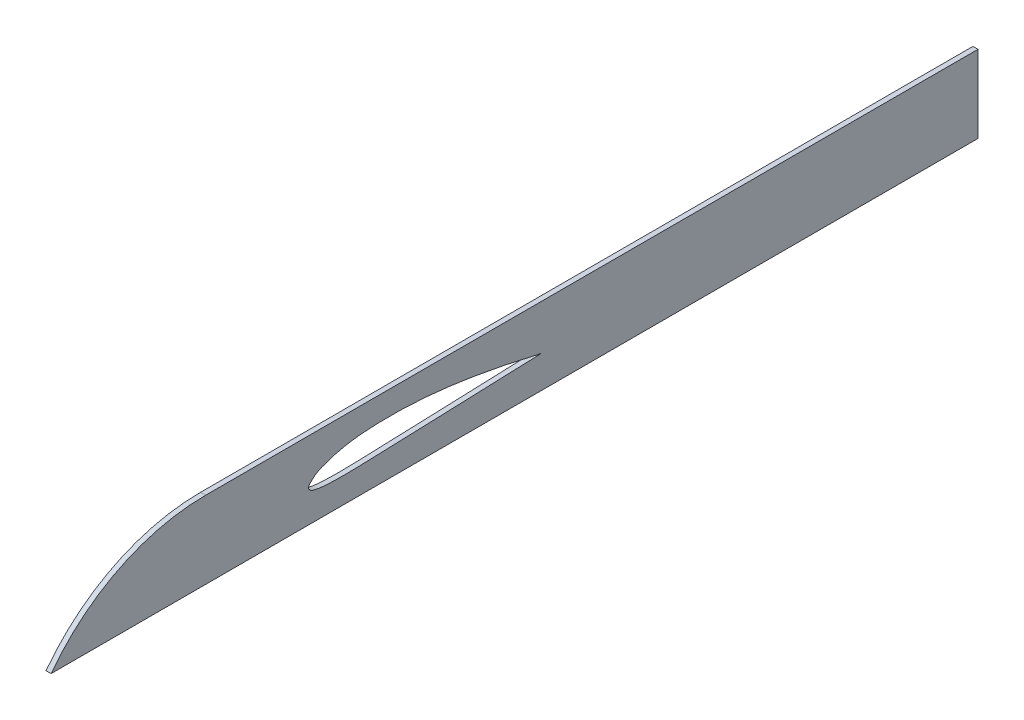
ISO-10303-21;
HEADER;
FILE_DESCRIPTION(('STEP AP214'),'2;1');
FILE_NAME('part.step','',(''),(''),'','','');
FILE_SCHEMA(('AUTOMOTIVE_DESIGN { 1 0 10303 214 1 1 1 1 }'));
ENDSEC;
DATA;
#1=APPLICATION_CONTEXT('core data for automotive mechanical design processes');
#2=APPLICATION_PROTOCOL_DEFINITION('international standard','automotive_design',2000,#1);
#3=PRODUCT_CONTEXT('',#1,'mechanical');
#4=PRODUCT('Part','Part','',(#3));
#5=PRODUCT_RELATED_PRODUCT_CATEGORY('part','',(#4));
#6=PRODUCT_DEFINITION_FORMATION('','',#4);
#7=PRODUCT_DEFINITION_CONTEXT('part definition',#1,'design');
#8=PRODUCT_DEFINITION('design','',#6,#7);
#9=PRODUCT_DEFINITION_SHAPE('','',#8);
#10=(LENGTH_UNIT() NAMED_UNIT(*) SI_UNIT(.MILLI.,.METRE.));
#11=(NAMED_UNIT(*) PLANE_ANGLE_UNIT() SI_UNIT($,.RADIAN.));
#12=(NAMED_UNIT(*) SI_UNIT($,.STERADIAN.) SOLID_ANGLE_UNIT());
#13=UNCERTAINTY_MEASURE_WITH_UNIT(LENGTH_MEASURE(1.E-05),#10,'distance_accuracy_value','');
#14=(GEOMETRIC_REPRESENTATION_CONTEXT(3) GLOBAL_UNCERTAINTY_ASSIGNED_CONTEXT((#13)) GLOBAL_UNIT_ASSIGNED_CONTEXT((#10,
#11,#12)) REPRESENTATION_CONTEXT('',''));
#15=CARTESIAN_POINT('',(0.,0.,0.));
#16=DIRECTION('',(0.,0.,1.));
#17=DIRECTION('',(1.,0.,0.));
#18=AXIS2_PLACEMENT_3D('',#15,#16,#17);
#19=CARTESIAN_POINT('',(5.,-114.3,-152.4));
#20=DIRECTION('',(-1.,0.,0.));
#21=DIRECTION('',(0.,0.,1.));
#22=AXIS2_PLACEMENT_3D('',#19,#20,#21);
#23=PLANE('',#22);
#24=CARTESIAN_POINT('',(5.,-114.3,-152.4));
#25=DIRECTION('',(1.,0.,0.));
#26=DIRECTION('',(0.,0.,1.));
#27=AXIS2_PLACEMENT_3D('',#24,#25,#26);
#28=CIRCLE('',#27,190.5);
#29=CARTESIAN_POINT('',(5.,76.1999999999999,-152.4));
#30=VERTEX_POINT('',#29);
#31=CARTESIAN_POINT('',(5.,0.,0.));
#32=VERTEX_POINT('',#31);
#33=EDGE_CURVE('E92',#30,#32,#28,.T.);
#34=ORIENTED_EDGE('',*,*,#33,.T.);
#35=DIRECTION('',(0.,0.,-1.));
#36=VECTOR('',#35,1.);
#37=CARTESIAN_POINT('',(5.,0.,0.));
#38=LINE('',#37,#36);
#39=CARTESIAN_POINT('',(5.,0.,-914.4));
#40=VERTEX_POINT('',#39);
#41=EDGE_CURVE('E87',#32,#40,#38,.T.);
#42=ORIENTED_EDGE('',*,*,#41,.T.);
#43=DIRECTION('',(0.,1.,0.));
#44=VECTOR('',#43,1.);
#45=CARTESIAN_POINT('',(5.,0.,-914.4));
#46=LINE('',#45,#44);
#47=CARTESIAN_POINT('',(5.,76.2,-914.4));
#48=VERTEX_POINT('',#47);
#49=EDGE_CURVE('E90',#40,#48,#46,.T.);
#50=ORIENTED_EDGE('',*,*,#49,.T.);
#51=DIRECTION('',(0.,0.,1.));
#52=VECTOR('',#51,1.);
#53=CARTESIAN_POINT('',(5.,76.2,-914.4));
#54=LINE('',#53,#52);
#55=EDGE_CURVE('E57',#48,#30,#54,.T.);
#56=ORIENTED_EDGE('',*,*,#55,.T.);
#57=EDGE_LOOP('',(#34,#42,#50,#56));
#58=FACE_BOUND('',#57,.T.);
#59=CARTESIAN_POINT('',(5.00000000000012,31.75,-482.600154209033));
#60=CARTESIAN_POINT('',(5.00000000000012,31.7969787483364,-482.60017015833));
#61=CARTESIAN_POINT('',(5.00000000000012,32.6447771322485,-482.64028381514));
#62=CARTESIAN_POINT('',(5.00000000000012,32.1873815343392,-479.982523669499));
#63=CARTESIAN_POINT('',(5.00000000000012,33.0271221292034,-478.115665344998));
#64=CARTESIAN_POINT('',(5.00000000000012,33.507921736001,-475.724301027393));
#65=CARTESIAN_POINT('',(5.00000000000012,34.2279005975688,-472.709352117299));
#66=CARTESIAN_POINT('',(5.00000000000012,35.1062067229994,-468.886614739731));
#67=CARTESIAN_POINT('',(5.00000000000012,36.1409522609736,-464.320717677363));
#68=CARTESIAN_POINT('',(5.00000000000012,37.1517373451688,-459.74847528013));
#69=CARTESIAN_POINT('',(5.00000000000012,38.140890664725,-455.178081305346));
#70=CARTESIAN_POINT('',(5.00000000000012,39.1033731232585,-450.606469545235));
#71=CARTESIAN_POINT('',(5.00000000000012,40.0566875517848,-446.039163177557));
#72=CARTESIAN_POINT('',(5.00000000000012,40.9351048604634,-441.46149814344));
#73=CARTESIAN_POINT('',(5.00000000000012,41.8525246212771,-436.897391982804));
#74=CARTESIAN_POINT('',(5.00000000000012,42.6829152446313,-432.319547923377));
#75=CARTESIAN_POINT('',(5.00000000000012,43.5534410076343,-427.754836962584));
#76=CARTESIAN_POINT('',(5.00000000000012,44.3451409728048,-423.179856990654));
#77=CARTESIAN_POINT('',(5.00000000000012,45.1414420190599,-418.612251439048));
#78=CARTESIAN_POINT('',(5.00000000000012,45.8592194934314,-414.035460927516));
#79=CARTESIAN_POINT('',(5.00000000000012,46.6150849999063,-409.469689950955));
#80=CARTESIAN_POINT('',(5.00000000000012,47.2928991694788,-404.895169699155));
#81=CARTESIAN_POINT('',(5.00000000000012,47.9733377379731,-400.326675803926));
#82=CARTESIAN_POINT('',(5.00000000000012,48.5827076098119,-395.752450022637));
#83=CARTESIAN_POINT('',(5.00000000000012,49.2007507441486,-391.185223071628));
#84=CARTESIAN_POINT('',(5.00000000000012,49.7161926956907,-386.609871363026));
#85=CARTESIAN_POINT('',(5.00000000000012,50.2244842177173,-382.038539278224));
#86=CARTESIAN_POINT('',(5.00000000000012,50.7253628394532,-377.46996388595));
#87=CARTESIAN_POINT('',(5.00000000000012,51.1250738010119,-372.895167583223));
#88=CARTESIAN_POINT('',(5.00000000000012,51.5270583980522,-368.324942709255));
#89=CARTESIAN_POINT('',(5.00000000000012,51.8828185008825,-363.753987996623));
#90=CARTESIAN_POINT('',(5.00000000000012,52.1470898889905,-359.180165639956));
#91=CARTESIAN_POINT('',(5.00000000000012,52.4125674057969,-354.609293691681));
#92=CARTESIAN_POINT('',(5.00000000000012,52.626976055273,-350.037633690696));
#93=CARTESIAN_POINT('',(5.00000000000012,52.7702275608238,-345.465251818578));
#94=CARTESIAN_POINT('',(5.00000000000012,52.8378122375479,-340.892754847925));
#95=CARTESIAN_POINT('',(5.00000000000012,52.8676606501421,-336.32059482558));
#96=CARTESIAN_POINT('',(5.00000000000012,52.8497254345569,-331.748328873294));
#97=CARTESIAN_POINT('',(5.00000000000012,52.7863116868297,-327.176040481476));
#98=CARTESIAN_POINT('',(5.00000000000012,52.6782488158101,-322.603629892253));
#99=CARTESIAN_POINT('',(5.00000000000012,52.5199118169366,-318.031413584805));
#100=CARTESIAN_POINT('',(5.00000000000012,52.3329455593649,-313.457313582338));
#101=CARTESIAN_POINT('',(5.00000000000012,52.036027869359,-308.884320844862));
#102=CARTESIAN_POINT('',(5.00000000000012,51.6586580619715,-304.309653751624));
#103=CARTESIAN_POINT('',(5.00000000000012,51.1635342152004,-299.734221484033));
#104=CARTESIAN_POINT('',(5.00000000000012,50.5326240551203,-295.157509369727));
#105=CARTESIAN_POINT('',(5.00000000000012,49.7377160841188,-290.581694172913));
#106=CARTESIAN_POINT('',(5.00000000000012,48.7741578578516,-286.009753881829));
#107=CARTESIAN_POINT('',(5.00000000000012,47.6903142901219,-281.428610585236));
#108=CARTESIAN_POINT('',(5.00000000000012,46.4234882890357,-276.84363987059));
#109=CARTESIAN_POINT('',(5.00000000000012,44.9030460473015,-272.27115206505));
#110=CARTESIAN_POINT('',(5.00000000000012,43.4968951702434,-268.44820892433));
#111=CARTESIAN_POINT('',(5.00000000000012,42.1414876906505,-265.410323966739));
#112=CARTESIAN_POINT('',(5.00000000000012,40.9504146666303,-263.112322773888));
#113=CARTESIAN_POINT('',(5.00000000000012,39.5570564541858,-260.786234986392));
#114=CARTESIAN_POINT('',(5.00000000000012,37.9333694874154,-258.638672859029));
#115=CARTESIAN_POINT('',(5.00000000000012,36.3930859832752,-257.015681400847));
#116=CARTESIAN_POINT('',(5.00000000000012,35.1282953222782,-255.801288583334));
#117=CARTESIAN_POINT('',(5.00000000000012,34.2200957709877,-255.014866713428));
#118=CARTESIAN_POINT('',(5.00000000000012,33.4393702604278,-254.49595513909));
#119=CARTESIAN_POINT('',(5.00000000000012,32.9230414274239,-254.247412686713));
#120=CARTESIAN_POINT('',(5.00000000000012,32.4805117787885,-254.08781539145));
#121=CARTESIAN_POINT('',(5.00000000000012,31.8426904638014,-253.939935661788));
#122=CARTESIAN_POINT('',(5.00000000000012,31.1780398930827,-254.003201841094));
#123=CARTESIAN_POINT('',(5.00000000000012,30.6063322142347,-254.25076304047));
#124=CARTESIAN_POINT('',(5.00000000000012,30.1435525417865,-254.487970184137));
#125=CARTESIAN_POINT('',(5.00000000000012,29.4720751544225,-255.000339131027));
#126=CARTESIAN_POINT('',(5.00000000000012,28.7529629731828,-255.764760467896));
#127=CARTESIAN_POINT('',(5.00000000000012,27.9352338004585,-256.966422477176));
#128=CARTESIAN_POINT('',(5.00000000000012,27.2727398771929,-258.67022047982));
#129=CARTESIAN_POINT('',(5.00000000000012,26.8435107637764,-260.846622407683));
#130=CARTESIAN_POINT('',(5.00000000000012,26.3864105472304,-263.129311348872));
#131=CARTESIAN_POINT('',(5.00000000000012,26.0441943134345,-265.417667326317));
#132=CARTESIAN_POINT('',(5.00000000000012,25.7102084696218,-268.464802745675));
#133=CARTESIAN_POINT('',(5.00000000000012,25.4640826122768,-272.278007626116));
#134=CARTESIAN_POINT('',(5.00000000000012,25.2605451448778,-276.8511967658));
#135=CARTESIAN_POINT('',(5.00000000000012,25.1030412163978,-281.423334984662));
#136=CARTESIAN_POINT('',(5.00000000000012,25.0815276125647,-285.996225617508));
#137=CARTESIAN_POINT('',(5.00000000000012,25.0187915301186,-290.568509129304));
#138=CARTESIAN_POINT('',(5.00000000000012,25.122224793075,-295.140173231717));
#139=CARTESIAN_POINT('',(5.00000000000012,25.1508428480969,-299.713349873405));
#140=CARTESIAN_POINT('',(5.00000000000012,25.3126195090135,-304.284370598076));
#141=CARTESIAN_POINT('',(5.00000000000012,25.4279379323416,-308.857211381917));
#142=CARTESIAN_POINT('',(5.00000000000012,25.5960104305777,-313.42873540667));
#143=CARTESIAN_POINT('',(5.00000000000012,25.7366197356728,-318.00169631115));
#144=CARTESIAN_POINT('',(5.00000000000012,25.9344072440514,-322.572604868665));
#145=CARTESIAN_POINT('',(5.00000000000012,26.0679480590371,-327.146126882564));
#146=CARTESIAN_POINT('',(5.00000000000012,26.2643539886555,-331.717080676365));
#147=CARTESIAN_POINT('',(5.00000000000012,26.4104888328222,-336.289860661108));
#148=CARTESIAN_POINT('',(5.00000000000012,26.5578596921853,-340.862595863795));
#149=CARTESIAN_POINT('',(5.00000000000012,26.7505571133193,-345.433684020535));
#150=CARTESIAN_POINT('',(5.00000000000012,26.8976855298794,-350.006428007166));
#151=CARTESIAN_POINT('',(5.00000000000012,27.0447901679554,-354.579172855315));
#152=CARTESIAN_POINT('',(5.00000000000012,27.2375589334469,-359.150258427178));
#153=CARTESIAN_POINT('',(5.00000000000012,27.3846682339351,-363.723003106403));
#154=CARTESIAN_POINT('',(5.00000000000012,27.5317780004097,-368.295747768744));
#155=CARTESIAN_POINT('',(5.00000000000012,27.7245453677674,-372.866833391266));
#156=CARTESIAN_POINT('',(5.00000000000012,27.8716551316067,-377.439578053693));
#157=CARTESIAN_POINT('',(5.00000000000012,28.0187644426365,-382.012322732573));
#158=CARTESIAN_POINT('',(5.00000000000012,28.2115331685923,-386.583408305731));
#159=CARTESIAN_POINT('',(5.00000000000012,28.3586379542472,-391.156153149048));
#160=CARTESIAN_POINT('',(5.00000000000012,28.5057658200096,-395.72889715371));
#161=CARTESIAN_POINT('',(5.00000000000012,28.6984652969993,-400.29998524315));
#162=CARTESIAN_POINT('',(5.00000000000012,28.8458284848919,-404.872720696965));
#163=CARTESIAN_POINT('',(5.00000000000012,28.9919919599959,-409.445499744469));
#164=CARTESIAN_POINT('',(5.00000000000012,29.188291024651,-414.016457036515));
#165=CARTESIAN_POINT('',(5.00000000000012,29.3222306334204,-418.589965995822));
#166=CARTESIAN_POINT('',(5.00000000000012,29.5185297071698,-423.160923277534));
#167=CARTESIAN_POINT('',(5.00000000000012,29.664693145902,-427.733702366372));
#168=CARTESIAN_POINT('',(5.00000000000012,29.8120564701916,-432.30643766518));
#169=CARTESIAN_POINT('',(5.00000000000012,30.0047554379044,-436.877526333382));
#170=CARTESIAN_POINT('',(5.00000000000012,30.1518852040915,-441.450268178332));
#171=CARTESIAN_POINT('',(5.00000000000012,30.2989828970988,-446.023021081991));
#172=CARTESIAN_POINT('',(5.00000000000012,30.4917780963628,-450.594076569921));
#173=CARTESIAN_POINT('',(5.00000000000012,30.6387886216759,-455.166933512469));
#174=CARTESIAN_POINT('',(5.00000000000012,30.7862670668006,-459.739259192128));
#175=CARTESIAN_POINT('',(5.00000000000012,30.9776583313905,-464.311908667682));
#176=CARTESIAN_POINT('',(5.00000000000012,31.1299030547573,-468.878817779009));
#177=CARTESIAN_POINT('',(5.00000000000012,31.2365211980275,-472.707491960929));
#178=CARTESIAN_POINT('',(5.00000000000012,31.3899978392381,-475.718239151376));
#179=CARTESIAN_POINT('',(5.00000000000012,31.3812104062824,-478.117040956672));
#180=CARTESIAN_POINT('',(5.00000000000012,31.8338193019088,-479.978948943739));
#181=CARTESIAN_POINT('',(5.00000000000012,30.8681550211961,-482.63867083727));
#182=CARTESIAN_POINT('',(5.00000000000012,31.7030212516637,-482.600138259737));
#183=CARTESIAN_POINT('',(5.00000000000012,31.75,-482.600154209033));
#184=B_SPLINE_CURVE_WITH_KNOTS('',3,(#59,#60,#61,#62,#63,#64,#65,#66,#67,#68,#69,#70,#71,#72,
#73,#74,#75,#76,#77,#78,#79,#80,#81,#82,#83,#84,#85,#86,#87,#88,#89,#90,#91,#92,#93,#94,#95,#96,
#97,#98,#99,#100,#101,#102,#103,#104,#105,#106,#107,#108,#109,#110,#111,#112,#113,#114,#115,
#116,#117,#118,#119,#120,#121,#122,#123,#124,#125,#126,#127,#128,#129,#130,#131,#132,#133,#134,
#135,#136,#137,#138,#139,#140,#141,#142,#143,#144,#145,#146,#147,#148,#149,#150,#151,#152,#153,
#154,#155,#156,#157,#158,#159,#160,#161,#162,#163,#164,#165,#166,#167,#168,#169,#170,#171,#172,
#173,#174,#175,#176,#177,#178,#179,#180,#181,#182,#183),.UNSPECIFIED.,.T.,.F.,(4,1,1,1,1,1,1,1,
1,1,1,1,1,1,1,1,1,1,1,1,1,1,1,1,1,1,1,1,1,1,1,1,1,1,1,1,1,1,1,1,1,1,1,1,1,1,1,1,1,1,1,1,1,1,1,1,
1,1,1,1,1,1,1,1,1,1,1,1,1,1,1,1,1,1,1,1,1,1,1,1,1,1,1,1,1,1,1,1,1,1,1,1,1,1,1,1,1,1,1,1,1,1,1,1,
1,1,1,1,1,1,1,1,1,1,1,1,1,1,1,1,1,1,4),(0.,0.000293365808662534,0.00532164017466566,
0.0103387292133674,0.0153670035793705,0.0203840926180723,0.0304182706954758,0.0404416024914457,
0.0504543150210545,0.0604566360224268,0.0704487939442089,0.0804310179328098,0.0903940642201864,
0.100357110507563,0.11030190372371,0.120246696939858,0.130174166814965,0.140093325200832,
0.149996563909746,0.159899802618659,0.169788063132481,0.179669188952908,0.189536756757346,
0.199397902217249,0.209241212830678,0.21907905733343,0.228911675824638,0.238730060621851,
0.248544183465038,0.25835050823059,0.268146954654559,0.277940594301047,0.287729350678479,
0.297512610464696,0.307292570813355,0.317071553337096,0.326850535860836,0.336630496209495,
0.346412411914752,0.356197259922253,0.365986016299685,0.375785512656923,0.38559963550011,
0.395437480002862,0.405311708087854,0.415239177962961,0.425231335884743,0.435287884616749,
0.4454428437726,0.455740406191331,0.466201501670347,0.471563180407638,0.477074156008609,
0.482801471774682,0.488942720606223,0.494304399343514,0.497140268827251,0.500195282443289,
0.5019990779814,0.503136330423955,0.50386319647057,0.505014031647029,0.507325031033084,
0.507960656951852,0.509010462124731,0.510653339756735,0.513350958495626,0.515710583501881,
0.519941847872338,0.52495893691104,0.529935838835567,0.534879969092478,0.539798891343855,
0.549601680563194,0.559390436940626,0.569173696726843,0.578953045946385,0.588732028470126,
0.598511988818785,0.608291949167444,0.61807520895366,0.627858468739877,0.637643316747377,
0.647428164754878,0.657214845005126,0.666999693012626,0.676786373262873,0.686571221270374,
0.696356069277874,0.706142749528122,0.715927597535622,0.725712445543123,0.73549912579337,
0.745283973800871,0.755068821808371,0.764855502058619,0.774640350066119,0.784425198073619,
0.794211878323867,0.803996726331367,0.813781574338868,0.823568254589115,0.833353102596616,
0.843137950604116,0.852924630854364,0.862709478861864,0.872496159112112,0.882281007119612,
0.892065855127112,0.90185253537736,0.91163738338486,0.921422231392361,0.931208911642609,
0.940993759650109,0.950778607657609,0.960565287907857,0.970350135915357,0.980134983922858,
0.985028324047981,0.989921664173105,0.994813294066214,0.999706634191338,1.),.UNSPECIFIED.);
#185=CARTESIAN_POINT('',(5.00000000000012,31.75,-482.600154209033));
#186=VERTEX_POINT('',#185);
#187=EDGE_CURVE('E112',#186,#186,#184,.F.);
#188=ORIENTED_EDGE('',*,*,#187,.T.);
#189=EDGE_LOOP('',(#188));
#190=FACE_BOUND('',#189,.T.);
#191=ADVANCED_FACE('F39',(#58,#190),#23,.F.);
#192=CARTESIAN_POINT('',(0.,-114.3,-152.4));
#193=DIRECTION('',(-1.,0.,0.));
#194=DIRECTION('',(0.,0.,1.));
#195=AXIS2_PLACEMENT_3D('',#192,#193,#194);
#196=PLANE('',#195);
#197=CARTESIAN_POINT('',(0.,-114.3,-152.4));
#198=DIRECTION('',(1.,0.,0.));
#199=DIRECTION('',(0.,0.,1.));
#200=AXIS2_PLACEMENT_3D('',#197,#198,#199);
#201=CIRCLE('',#200,190.5);
#202=CARTESIAN_POINT('',(0.,76.1999999999999,-152.4));
#203=VERTEX_POINT('',#202);
#204=CARTESIAN_POINT('',(0.,0.,0.));
#205=VERTEX_POINT('',#204);
#206=EDGE_CURVE('E108',#203,#205,#201,.T.);
#207=ORIENTED_EDGE('',*,*,#206,.F.);
#208=DIRECTION('',(0.,0.,1.));
#209=VECTOR('',#208,1.);
#210=CARTESIAN_POINT('',(0.,76.2,-914.4));
#211=LINE('',#210,#209);
#212=CARTESIAN_POINT('',(0.,76.2,-914.4));
#213=VERTEX_POINT('',#212);
#214=EDGE_CURVE('E80',#213,#203,#211,.T.);
#215=ORIENTED_EDGE('',*,*,#214,.F.);
#216=DIRECTION('',(0.,1.,0.));
#217=VECTOR('',#216,1.);
#218=CARTESIAN_POINT('',(0.,0.,-914.4));
#219=LINE('',#218,#217);
#220=CARTESIAN_POINT('',(0.,0.,-914.4));
#221=VERTEX_POINT('',#220);
#222=EDGE_CURVE('E74',#221,#213,#219,.T.);
#223=ORIENTED_EDGE('',*,*,#222,.F.);
#224=DIRECTION('',(0.,0.,-1.));
#225=VECTOR('',#224,1.);
#226=CARTESIAN_POINT('',(0.,0.,0.));
#227=LINE('',#226,#225);
#228=EDGE_CURVE('E97',#205,#221,#227,.T.);
#229=ORIENTED_EDGE('',*,*,#228,.F.);
#230=EDGE_LOOP('',(#207,#215,#223,#229));
#231=FACE_BOUND('',#230,.T.);
#232=CARTESIAN_POINT('',(0.,31.75,-482.600154209033));
#233=CARTESIAN_POINT('',(0.,31.7969787483364,-482.60017015833));
#234=CARTESIAN_POINT('',(0.,32.6447771322485,-482.64028381514));
#235=CARTESIAN_POINT('',(0.,32.1873815343392,-479.982523669499));
#236=CARTESIAN_POINT('',(0.,33.0271221292034,-478.115665344998));
#237=CARTESIAN_POINT('',(0.,33.507921736001,-475.724301027393));
#238=CARTESIAN_POINT('',(0.,34.2279005975688,-472.709352117299));
#239=CARTESIAN_POINT('',(0.,35.1062067229994,-468.886614739731));
#240=CARTESIAN_POINT('',(0.,36.1409522609736,-464.320717677363));
#241=CARTESIAN_POINT('',(0.,37.1517373451688,-459.74847528013));
#242=CARTESIAN_POINT('',(0.,38.140890664725,-455.178081305346));
#243=CARTESIAN_POINT('',(0.,39.1033731232585,-450.606469545235));
#244=CARTESIAN_POINT('',(0.,40.0566875517848,-446.039163177557));
#245=CARTESIAN_POINT('',(0.,40.9351048604634,-441.46149814344));
#246=CARTESIAN_POINT('',(0.,41.8525246212771,-436.897391982804));
#247=CARTESIAN_POINT('',(0.,42.6829152446313,-432.319547923377));
#248=CARTESIAN_POINT('',(0.,43.5534410076343,-427.754836962584));
#249=CARTESIAN_POINT('',(0.,44.3451409728048,-423.179856990654));
#250=CARTESIAN_POINT('',(0.,45.1414420190599,-418.612251439048));
#251=CARTESIAN_POINT('',(0.,45.8592194934314,-414.035460927516));
#252=CARTESIAN_POINT('',(0.,46.6150849999063,-409.469689950955));
#253=CARTESIAN_POINT('',(0.,47.2928991694788,-404.895169699155));
#254=CARTESIAN_POINT('',(0.,47.9733377379731,-400.326675803926));
#255=CARTESIAN_POINT('',(0.,48.5827076098119,-395.752450022637));
#256=CARTESIAN_POINT('',(0.,49.2007507441486,-391.185223071628));
#257=CARTESIAN_POINT('',(0.,49.7161926956907,-386.609871363026));
#258=CARTESIAN_POINT('',(0.,50.2244842177173,-382.038539278224));
#259=CARTESIAN_POINT('',(0.,50.7253628394532,-377.46996388595));
#260=CARTESIAN_POINT('',(0.,51.1250738010119,-372.895167583223));
#261=CARTESIAN_POINT('',(0.,51.5270583980522,-368.324942709255));
#262=CARTESIAN_POINT('',(0.,51.8828185008825,-363.753987996623));
#263=CARTESIAN_POINT('',(0.,52.1470898889905,-359.180165639956));
#264=CARTESIAN_POINT('',(0.,52.4125674057969,-354.609293691681));
#265=CARTESIAN_POINT('',(0.,52.626976055273,-350.037633690696));
#266=CARTESIAN_POINT('',(0.,52.7702275608238,-345.465251818578));
#267=CARTESIAN_POINT('',(0.,52.8378122375479,-340.892754847925));
#268=CARTESIAN_POINT('',(0.,52.8676606501421,-336.32059482558));
#269=CARTESIAN_POINT('',(0.,52.8497254345569,-331.748328873294));
#270=CARTESIAN_POINT('',(0.,52.7863116868297,-327.176040481476));
#271=CARTESIAN_POINT('',(0.,52.6782488158101,-322.603629892253));
#272=CARTESIAN_POINT('',(0.,52.5199118169366,-318.031413584805));
#273=CARTESIAN_POINT('',(0.,52.3329455593649,-313.457313582338));
#274=CARTESIAN_POINT('',(0.,52.036027869359,-308.884320844862));
#275=CARTESIAN_POINT('',(0.,51.6586580619715,-304.309653751624));
#276=CARTESIAN_POINT('',(0.,51.1635342152004,-299.734221484033));
#277=CARTESIAN_POINT('',(0.,50.5326240551203,-295.157509369727));
#278=CARTESIAN_POINT('',(0.,49.7377160841188,-290.581694172913));
#279=CARTESIAN_POINT('',(0.,48.7741578578516,-286.009753881829));
#280=CARTESIAN_POINT('',(0.,47.6903142901219,-281.428610585236));
#281=CARTESIAN_POINT('',(0.,46.4234882890357,-276.84363987059));
#282=CARTESIAN_POINT('',(0.,44.9030460473015,-272.27115206505));
#283=CARTESIAN_POINT('',(0.,43.4968951702434,-268.44820892433));
#284=CARTESIAN_POINT('',(0.,42.1414876906505,-265.410323966739));
#285=CARTESIAN_POINT('',(0.,40.9504146666303,-263.112322773888));
#286=CARTESIAN_POINT('',(0.,39.5570564541858,-260.786234986392));
#287=CARTESIAN_POINT('',(0.,37.9333694874154,-258.638672859029));
#288=CARTESIAN_POINT('',(0.,36.3930859832752,-257.015681400847));
#289=CARTESIAN_POINT('',(0.,35.1282953222782,-255.801288583334));
#290=CARTESIAN_POINT('',(0.,34.2200957709877,-255.014866713428));
#291=CARTESIAN_POINT('',(0.,33.4393702604278,-254.49595513909));
#292=CARTESIAN_POINT('',(0.,32.9230414274239,-254.247412686713));
#293=CARTESIAN_POINT('',(0.,32.4805117787885,-254.08781539145));
#294=CARTESIAN_POINT('',(0.,31.8426904638014,-253.939935661788));
#295=CARTESIAN_POINT('',(0.,31.1780398930827,-254.003201841094));
#296=CARTESIAN_POINT('',(0.,30.6063322142347,-254.25076304047));
#297=CARTESIAN_POINT('',(0.,30.1435525417865,-254.487970184137));
#298=CARTESIAN_POINT('',(0.,29.4720751544225,-255.000339131027));
#299=CARTESIAN_POINT('',(0.,28.7529629731828,-255.764760467896));
#300=CARTESIAN_POINT('',(0.,27.9352338004585,-256.966422477176));
#301=CARTESIAN_POINT('',(0.,27.2727398771929,-258.67022047982));
#302=CARTESIAN_POINT('',(0.,26.8435107637764,-260.846622407683));
#303=CARTESIAN_POINT('',(0.,26.3864105472304,-263.129311348872));
#304=CARTESIAN_POINT('',(0.,26.0441943134345,-265.417667326317));
#305=CARTESIAN_POINT('',(0.,25.7102084696218,-268.464802745675));
#306=CARTESIAN_POINT('',(0.,25.4640826122768,-272.278007626116));
#307=CARTESIAN_POINT('',(0.,25.2605451448778,-276.8511967658));
#308=CARTESIAN_POINT('',(0.,25.1030412163978,-281.423334984662));
#309=CARTESIAN_POINT('',(0.,25.0815276125647,-285.996225617508));
#310=CARTESIAN_POINT('',(0.,25.0187915301186,-290.568509129304));
#311=CARTESIAN_POINT('',(0.,25.122224793075,-295.140173231717));
#312=CARTESIAN_POINT('',(0.,25.1508428480969,-299.713349873405));
#313=CARTESIAN_POINT('',(0.,25.3126195090135,-304.284370598076));
#314=CARTESIAN_POINT('',(0.,25.4279379323416,-308.857211381917));
#315=CARTESIAN_POINT('',(0.,25.5960104305777,-313.42873540667));
#316=CARTESIAN_POINT('',(0.,25.7366197356728,-318.00169631115));
#317=CARTESIAN_POINT('',(0.,25.9344072440514,-322.572604868665));
#318=CARTESIAN_POINT('',(0.,26.0679480590371,-327.146126882564));
#319=CARTESIAN_POINT('',(0.,26.2643539886555,-331.717080676365));
#320=CARTESIAN_POINT('',(0.,26.4104888328222,-336.289860661108));
#321=CARTESIAN_POINT('',(0.,26.5578596921853,-340.862595863795));
#322=CARTESIAN_POINT('',(0.,26.7505571133193,-345.433684020535));
#323=CARTESIAN_POINT('',(0.,26.8976855298794,-350.006428007166));
#324=CARTESIAN_POINT('',(0.,27.0447901679554,-354.579172855315));
#325=CARTESIAN_POINT('',(0.,27.2375589334469,-359.150258427178));
#326=CARTESIAN_POINT('',(0.,27.3846682339351,-363.723003106403));
#327=CARTESIAN_POINT('',(0.,27.5317780004097,-368.295747768744));
#328=CARTESIAN_POINT('',(0.,27.7245453677674,-372.866833391266));
#329=CARTESIAN_POINT('',(0.,27.8716551316067,-377.439578053693));
#330=CARTESIAN_POINT('',(0.,28.0187644426365,-382.012322732573));
#331=CARTESIAN_POINT('',(0.,28.2115331685923,-386.583408305731));
#332=CARTESIAN_POINT('',(0.,28.3586379542472,-391.156153149048));
#333=CARTESIAN_POINT('',(0.,28.5057658200096,-395.72889715371));
#334=CARTESIAN_POINT('',(0.,28.6984652969993,-400.29998524315));
#335=CARTESIAN_POINT('',(0.,28.8458284848919,-404.872720696965));
#336=CARTESIAN_POINT('',(0.,28.9919919599959,-409.445499744469));
#337=CARTESIAN_POINT('',(0.,29.188291024651,-414.016457036515));
#338=CARTESIAN_POINT('',(0.,29.3222306334204,-418.589965995822));
#339=CARTESIAN_POINT('',(0.,29.5185297071698,-423.160923277534));
#340=CARTESIAN_POINT('',(0.,29.664693145902,-427.733702366372));
#341=CARTESIAN_POINT('',(0.,29.8120564701916,-432.30643766518));
#342=CARTESIAN_POINT('',(0.,30.0047554379044,-436.877526333382));
#343=CARTESIAN_POINT('',(0.,30.1518852040915,-441.450268178332));
#344=CARTESIAN_POINT('',(0.,30.2989828970988,-446.023021081991));
#345=CARTESIAN_POINT('',(0.,30.4917780963628,-450.594076569921));
#346=CARTESIAN_POINT('',(0.,30.6387886216759,-455.166933512469));
#347=CARTESIAN_POINT('',(0.,30.7862670668006,-459.739259192128));
#348=CARTESIAN_POINT('',(0.,30.9776583313905,-464.311908667682));
#349=CARTESIAN_POINT('',(0.,31.1299030547573,-468.878817779009));
#350=CARTESIAN_POINT('',(0.,31.2365211980275,-472.707491960929));
#351=CARTESIAN_POINT('',(0.,31.3899978392381,-475.718239151376));
#352=CARTESIAN_POINT('',(0.,31.3812104062824,-478.117040956672));
#353=CARTESIAN_POINT('',(0.,31.8338193019088,-479.978948943739));
#354=CARTESIAN_POINT('',(0.,30.8681550211961,-482.63867083727));
#355=CARTESIAN_POINT('',(0.,31.7030212516637,-482.600138259737));
#356=CARTESIAN_POINT('',(0.,31.75,-482.600154209033));
#357=B_SPLINE_CURVE_WITH_KNOTS('',3,(#232,#233,#234,#235,#236,#237,#238,#239,#240,#241,#242,
#243,#244,#245,#246,#247,#248,#249,#250,#251,#252,#253,#254,#255,#256,#257,#258,#259,#260,#261,
#262,#263,#264,#265,#266,#267,#268,#269,#270,#271,#272,#273,#274,#275,#276,#277,#278,#279,#280,
#281,#282,#283,#284,#285,#286,#287,#288,#289,#290,#291,#292,#293,#294,#295,#296,#297,#298,#299,
#300,#301,#302,#303,#304,#305,#306,#307,#308,#309,#310,#311,#312,#313,#314,#315,#316,#317,#318,
#319,#320,#321,#322,#323,#324,#325,#326,#327,#328,#329,#330,#331,#332,#333,#334,#335,#336,#337,
#338,#339,#340,#341,#342,#343,#344,#345,#346,#347,#348,#349,#350,#351,#352,#353,#354,#355,#356),
.UNSPECIFIED.,.T.,.F.,(4,1,1,1,1,1,1,1,1,1,1,1,1,1,1,1,1,1,1,1,1,1,1,1,1,1,1,1,1,1,1,1,1,1,1,1,
1,1,1,1,1,1,1,1,1,1,1,1,1,1,1,1,1,1,1,1,1,1,1,1,1,1,1,1,1,1,1,1,1,1,1,1,1,1,1,1,1,1,1,1,1,1,1,1,
1,1,1,1,1,1,1,1,1,1,1,1,1,1,1,1,1,1,1,1,1,1,1,1,1,1,1,1,1,1,1,1,1,1,1,1,1,1,4),(0.,
0.000293365808662534,0.00532164017466566,0.0103387292133674,0.0153670035793705,
0.0203840926180723,0.0304182706954758,0.0404416024914457,0.0504543150210545,0.0604566360224268,
0.0704487939442089,0.0804310179328098,0.0903940642201864,0.100357110507563,0.11030190372371,
0.120246696939858,0.130174166814965,0.140093325200832,0.149996563909746,0.159899802618659,
0.169788063132481,0.179669188952908,0.189536756757346,0.199397902217249,0.209241212830678,
0.21907905733343,0.228911675824638,0.238730060621851,0.248544183465038,0.25835050823059,
0.268146954654559,0.277940594301047,0.287729350678479,0.297512610464696,0.307292570813355,
0.317071553337096,0.326850535860836,0.336630496209495,0.346412411914752,0.356197259922253,
0.365986016299685,0.375785512656923,0.38559963550011,0.395437480002862,0.405311708087854,
0.415239177962961,0.425231335884743,0.435287884616749,0.4454428437726,0.455740406191331,
0.466201501670347,0.471563180407638,0.477074156008609,0.482801471774682,0.488942720606223,
0.494304399343514,0.497140268827251,0.500195282443289,0.5019990779814,0.503136330423955,
0.50386319647057,0.505014031647029,0.507325031033084,0.507960656951852,0.509010462124731,
0.510653339756735,0.513350958495626,0.515710583501881,0.519941847872338,0.52495893691104,
0.529935838835567,0.534879969092478,0.539798891343855,0.549601680563194,0.559390436940626,
0.569173696726843,0.578953045946385,0.588732028470126,0.598511988818785,0.608291949167444,
0.61807520895366,0.627858468739877,0.637643316747377,0.647428164754878,0.657214845005126,
0.666999693012626,0.676786373262873,0.686571221270374,0.696356069277874,0.706142749528122,
0.715927597535622,0.725712445543123,0.73549912579337,0.745283973800871,0.755068821808371,
0.764855502058619,0.774640350066119,0.784425198073619,0.794211878323867,0.803996726331367,
0.813781574338868,0.823568254589115,0.833353102596616,0.843137950604116,0.852924630854364,
0.862709478861864,0.872496159112112,0.882281007119612,0.892065855127112,0.90185253537736,
0.91163738338486,0.921422231392361,0.931208911642609,0.940993759650109,0.950778607657609,
0.960565287907857,0.970350135915357,0.980134983922858,0.985028324047981,0.989921664173105,
0.994813294066214,0.999706634191338,1.),.UNSPECIFIED.);
#358=CARTESIAN_POINT('',(0.,31.75,-482.600154209033));
#359=VERTEX_POINT('',#358);
#360=EDGE_CURVE('E135',#359,#359,#357,.T.);
#361=ORIENTED_EDGE('',*,*,#360,.T.);
#362=EDGE_LOOP('',(#361));
#363=FACE_BOUND('',#362,.T.);
#364=ADVANCED_FACE('F125',(#231,#363),#196,.T.);
#365=CARTESIAN_POINT('',(5.,-114.3,-152.4));
#366=DIRECTION('',(-1.,0.,0.));
#367=DIRECTION('',(0.,0.,1.));
#368=AXIS2_PLACEMENT_3D('',#365,#366,#367);
#369=CYLINDRICAL_SURFACE('',#368,190.5);
#370=ORIENTED_EDGE('',*,*,#206,.T.);
#371=DIRECTION('',(-1.,0.,0.));
#372=VECTOR('',#371,1.);
#373=CARTESIAN_POINT('',(5.,0.,0.));
#374=LINE('',#373,#372);
#375=EDGE_CURVE('E11',#32,#205,#374,.T.);
#376=ORIENTED_EDGE('',*,*,#375,.F.);
#377=ORIENTED_EDGE('',*,*,#33,.F.);
#378=DIRECTION('',(-1.,0.,0.));
#379=VECTOR('',#378,1.);
#380=CARTESIAN_POINT('',(5.,76.1999999999999,-152.4));
#381=LINE('',#380,#379);
#382=EDGE_CURVE('E104',#30,#203,#381,.T.);
#383=ORIENTED_EDGE('',*,*,#382,.T.);
#384=EDGE_LOOP('',(#370,#376,#377,#383));
#385=FACE_BOUND('',#384,.T.);
#386=ADVANCED_FACE('F41',(#385),#369,.T.);
#387=CARTESIAN_POINT('',(5.,0.,0.));
#388=DIRECTION('',(0.,1.,0.));
#389=DIRECTION('',(0.,0.,1.));
#390=AXIS2_PLACEMENT_3D('',#387,#388,#389);
#391=PLANE('',#390);
#392=ORIENTED_EDGE('',*,*,#228,.T.);
#393=DIRECTION('',(-1.,0.,0.));
#394=VECTOR('',#393,1.);
#395=CARTESIAN_POINT('',(5.,0.,-914.4));
#396=LINE('',#395,#394);
#397=EDGE_CURVE('E49',#40,#221,#396,.T.);
#398=ORIENTED_EDGE('',*,*,#397,.F.);
#399=ORIENTED_EDGE('',*,*,#41,.F.);
#400=ORIENTED_EDGE('',*,*,#375,.T.);
#401=EDGE_LOOP('',(#392,#398,#399,#400));
#402=FACE_BOUND('',#401,.T.);
#403=ADVANCED_FACE('F96',(#402),#391,.F.);
#404=CARTESIAN_POINT('',(5.,0.,-914.4));
#405=DIRECTION('',(0.,0.,1.));
#406=DIRECTION('',(1.,0.,0.));
#407=AXIS2_PLACEMENT_3D('',#404,#405,#406);
#408=PLANE('',#407);
#409=ORIENTED_EDGE('',*,*,#222,.T.);
#410=DIRECTION('',(-1.,0.,0.));
#411=VECTOR('',#410,1.);
#412=CARTESIAN_POINT('',(5.,76.2,-914.4));
#413=LINE('',#412,#411);
#414=EDGE_CURVE('E99',#48,#213,#413,.T.);
#415=ORIENTED_EDGE('',*,*,#414,.F.);
#416=ORIENTED_EDGE('',*,*,#49,.F.);
#417=ORIENTED_EDGE('',*,*,#397,.T.);
#418=EDGE_LOOP('',(#409,#415,#416,#417));
#419=FACE_BOUND('',#418,.T.);
#420=ADVANCED_FACE('F100',(#419),#408,.F.);
#421=CARTESIAN_POINT('',(5.,76.2,-914.4));
#422=DIRECTION('',(0.,-1.,0.));
#423=DIRECTION('',(0.,0.,-1.));
#424=AXIS2_PLACEMENT_3D('',#421,#422,#423);
#425=PLANE('',#424);
#426=ORIENTED_EDGE('',*,*,#214,.T.);
#427=ORIENTED_EDGE('',*,*,#382,.F.);
#428=ORIENTED_EDGE('',*,*,#55,.F.);
#429=ORIENTED_EDGE('',*,*,#414,.T.);
#430=EDGE_LOOP('',(#426,#427,#428,#429));
#431=FACE_BOUND('',#430,.T.);
#432=ADVANCED_FACE('F122',(#431),#425,.F.);
#433=CARTESIAN_POINT('',(235.38968891148,31.75,-482.600154209033));
#434=CARTESIAN_POINT('',(235.38968891148,31.7969787483364,-482.60017015833));
#435=CARTESIAN_POINT('',(235.38968891148,32.6447771322485,-482.64028381514));
#436=CARTESIAN_POINT('',(235.38968891148,32.1873815343392,-479.982523669499));
#437=CARTESIAN_POINT('',(235.38968891148,33.0271221292034,-478.115665344998));
#438=CARTESIAN_POINT('',(235.38968891148,33.507921736001,-475.724301027393));
#439=CARTESIAN_POINT('',(235.38968891148,34.2279005975688,-472.709352117299));
#440=CARTESIAN_POINT('',(235.38968891148,35.1062067229994,-468.886614739731));
#441=CARTESIAN_POINT('',(235.38968891148,36.1409522609736,-464.320717677363));
#442=CARTESIAN_POINT('',(235.38968891148,37.1517373451688,-459.74847528013));
#443=CARTESIAN_POINT('',(235.38968891148,38.140890664725,-455.178081305346));
#444=CARTESIAN_POINT('',(235.38968891148,39.1033731232585,-450.606469545235));
#445=CARTESIAN_POINT('',(235.38968891148,40.0566875517848,-446.039163177557));
#446=CARTESIAN_POINT('',(235.38968891148,40.9351048604634,-441.46149814344));
#447=CARTESIAN_POINT('',(235.38968891148,41.8525246212771,-436.897391982804));
#448=CARTESIAN_POINT('',(235.38968891148,42.6829152446313,-432.319547923377));
#449=CARTESIAN_POINT('',(235.38968891148,43.5534410076343,-427.754836962584));
#450=CARTESIAN_POINT('',(235.38968891148,44.3451409728048,-423.179856990654));
#451=CARTESIAN_POINT('',(235.38968891148,45.1414420190599,-418.612251439048));
#452=CARTESIAN_POINT('',(235.38968891148,45.8592194934314,-414.035460927516));
#453=CARTESIAN_POINT('',(235.38968891148,46.6150849999063,-409.469689950955));
#454=CARTESIAN_POINT('',(235.38968891148,47.2928991694788,-404.895169699155));
#455=CARTESIAN_POINT('',(235.38968891148,47.9733377379731,-400.326675803926));
#456=CARTESIAN_POINT('',(235.38968891148,48.5827076098119,-395.752450022637));
#457=CARTESIAN_POINT('',(235.38968891148,49.2007507441486,-391.185223071628));
#458=CARTESIAN_POINT('',(235.38968891148,49.7161926956907,-386.609871363026));
#459=CARTESIAN_POINT('',(235.38968891148,50.2244842177173,-382.038539278224));
#460=CARTESIAN_POINT('',(235.38968891148,50.7253628394532,-377.46996388595));
#461=CARTESIAN_POINT('',(235.38968891148,51.1250738010119,-372.895167583223));
#462=CARTESIAN_POINT('',(235.38968891148,51.5270583980522,-368.324942709255));
#463=CARTESIAN_POINT('',(235.38968891148,51.8828185008825,-363.753987996623));
#464=CARTESIAN_POINT('',(235.38968891148,52.1470898889905,-359.180165639956));
#465=CARTESIAN_POINT('',(235.38968891148,52.4125674057969,-354.609293691681));
#466=CARTESIAN_POINT('',(235.38968891148,52.626976055273,-350.037633690696));
#467=CARTESIAN_POINT('',(235.38968891148,52.7702275608238,-345.465251818578));
#468=CARTESIAN_POINT('',(235.38968891148,52.8378122375479,-340.892754847925));
#469=CARTESIAN_POINT('',(235.38968891148,52.8676606501421,-336.32059482558));
#470=CARTESIAN_POINT('',(235.38968891148,52.8497254345569,-331.748328873294));
#471=CARTESIAN_POINT('',(235.38968891148,52.7863116868297,-327.176040481476));
#472=CARTESIAN_POINT('',(235.38968891148,52.6782488158101,-322.603629892253));
#473=CARTESIAN_POINT('',(235.38968891148,52.5199118169366,-318.031413584805));
#474=CARTESIAN_POINT('',(235.38968891148,52.3329455593649,-313.457313582338));
#475=CARTESIAN_POINT('',(235.38968891148,52.036027869359,-308.884320844862));
#476=CARTESIAN_POINT('',(235.38968891148,51.6586580619715,-304.309653751624));
#477=CARTESIAN_POINT('',(235.38968891148,51.1635342152004,-299.734221484033));
#478=CARTESIAN_POINT('',(235.38968891148,50.5326240551203,-295.157509369727));
#479=CARTESIAN_POINT('',(235.38968891148,49.7377160841188,-290.581694172913));
#480=CARTESIAN_POINT('',(235.38968891148,48.7741578578516,-286.009753881829));
#481=CARTESIAN_POINT('',(235.38968891148,47.6903142901219,-281.428610585236));
#482=CARTESIAN_POINT('',(235.38968891148,46.4234882890357,-276.84363987059));
#483=CARTESIAN_POINT('',(235.38968891148,44.9030460473015,-272.27115206505));
#484=CARTESIAN_POINT('',(235.38968891148,43.4968951702434,-268.44820892433));
#485=CARTESIAN_POINT('',(235.38968891148,42.1414876906505,-265.410323966739));
#486=CARTESIAN_POINT('',(235.38968891148,40.9504146666303,-263.112322773888));
#487=CARTESIAN_POINT('',(235.38968891148,39.5570564541858,-260.786234986392));
#488=CARTESIAN_POINT('',(235.38968891148,37.9333694874154,-258.638672859029));
#489=CARTESIAN_POINT('',(235.38968891148,36.3930859832752,-257.015681400847));
#490=CARTESIAN_POINT('',(235.38968891148,35.1282953222782,-255.801288583334));
#491=CARTESIAN_POINT('',(235.38968891148,34.2200957709877,-255.014866713428));
#492=CARTESIAN_POINT('',(235.38968891148,33.4393702604278,-254.49595513909));
#493=CARTESIAN_POINT('',(235.38968891148,32.9230414274239,-254.247412686713));
#494=CARTESIAN_POINT('',(235.38968891148,32.4805117787885,-254.08781539145));
#495=CARTESIAN_POINT('',(235.38968891148,31.8426904638014,-253.939935661788));
#496=CARTESIAN_POINT('',(235.38968891148,31.1780398930827,-254.003201841094));
#497=CARTESIAN_POINT('',(235.38968891148,30.6063322142347,-254.25076304047));
#498=CARTESIAN_POINT('',(235.38968891148,30.1435525417865,-254.487970184137));
#499=CARTESIAN_POINT('',(235.38968891148,29.4720751544225,-255.000339131027));
#500=CARTESIAN_POINT('',(235.38968891148,28.7529629731828,-255.764760467896));
#501=CARTESIAN_POINT('',(235.38968891148,27.9352338004585,-256.966422477176));
#502=CARTESIAN_POINT('',(235.38968891148,27.2727398771929,-258.67022047982));
#503=CARTESIAN_POINT('',(235.38968891148,26.8435107637764,-260.846622407683));
#504=CARTESIAN_POINT('',(235.38968891148,26.3864105472304,-263.129311348872));
#505=CARTESIAN_POINT('',(235.38968891148,26.0441943134345,-265.417667326317));
#506=CARTESIAN_POINT('',(235.38968891148,25.7102084696218,-268.464802745675));
#507=CARTESIAN_POINT('',(235.38968891148,25.4640826122768,-272.278007626116));
#508=CARTESIAN_POINT('',(235.38968891148,25.2605451448778,-276.8511967658));
#509=CARTESIAN_POINT('',(235.38968891148,25.1030412163978,-281.423334984662));
#510=CARTESIAN_POINT('',(235.38968891148,25.0815276125647,-285.996225617508));
#511=CARTESIAN_POINT('',(235.38968891148,25.0187915301186,-290.568509129304));
#512=CARTESIAN_POINT('',(235.38968891148,25.122224793075,-295.140173231717));
#513=CARTESIAN_POINT('',(235.38968891148,25.1508428480969,-299.713349873405));
#514=CARTESIAN_POINT('',(235.38968891148,25.3126195090135,-304.284370598076));
#515=CARTESIAN_POINT('',(235.38968891148,25.4279379323416,-308.857211381917));
#516=CARTESIAN_POINT('',(235.38968891148,25.5960104305777,-313.42873540667));
#517=CARTESIAN_POINT('',(235.38968891148,25.7366197356728,-318.00169631115));
#518=CARTESIAN_POINT('',(235.38968891148,25.9344072440514,-322.572604868665));
#519=CARTESIAN_POINT('',(235.38968891148,26.0679480590371,-327.146126882564));
#520=CARTESIAN_POINT('',(235.38968891148,26.2643539886555,-331.717080676365));
#521=CARTESIAN_POINT('',(235.38968891148,26.4104888328222,-336.289860661108));
#522=CARTESIAN_POINT('',(235.38968891148,26.5578596921853,-340.862595863795));
#523=CARTESIAN_POINT('',(235.38968891148,26.7505571133193,-345.433684020535));
#524=CARTESIAN_POINT('',(235.38968891148,26.8976855298794,-350.006428007166));
#525=CARTESIAN_POINT('',(235.38968891148,27.0447901679554,-354.579172855315));
#526=CARTESIAN_POINT('',(235.38968891148,27.2375589334469,-359.150258427178));
#527=CARTESIAN_POINT('',(235.38968891148,27.3846682339351,-363.723003106403));
#528=CARTESIAN_POINT('',(235.38968891148,27.5317780004097,-368.295747768744));
#529=CARTESIAN_POINT('',(235.38968891148,27.7245453677674,-372.866833391266));
#530=CARTESIAN_POINT('',(235.38968891148,27.8716551316067,-377.439578053693));
#531=CARTESIAN_POINT('',(235.38968891148,28.0187644426365,-382.012322732573));
#532=CARTESIAN_POINT('',(235.38968891148,28.2115331685923,-386.583408305731));
#533=CARTESIAN_POINT('',(235.38968891148,28.3586379542472,-391.156153149048));
#534=CARTESIAN_POINT('',(235.38968891148,28.5057658200096,-395.72889715371));
#535=CARTESIAN_POINT('',(235.38968891148,28.6984652969993,-400.29998524315));
#536=CARTESIAN_POINT('',(235.38968891148,28.8458284848919,-404.872720696965));
#537=CARTESIAN_POINT('',(235.38968891148,28.9919919599959,-409.445499744469));
#538=CARTESIAN_POINT('',(235.38968891148,29.188291024651,-414.016457036515));
#539=CARTESIAN_POINT('',(235.38968891148,29.3222306334204,-418.589965995822));
#540=CARTESIAN_POINT('',(235.38968891148,29.5185297071698,-423.160923277534));
#541=CARTESIAN_POINT('',(235.38968891148,29.664693145902,-427.733702366372));
#542=CARTESIAN_POINT('',(235.38968891148,29.8120564701916,-432.30643766518));
#543=CARTESIAN_POINT('',(235.38968891148,30.0047554379044,-436.877526333382));
#544=CARTESIAN_POINT('',(235.38968891148,30.1518852040915,-441.450268178332));
#545=CARTESIAN_POINT('',(235.38968891148,30.2989828970988,-446.023021081991));
#546=CARTESIAN_POINT('',(235.38968891148,30.4917780963628,-450.594076569921));
#547=CARTESIAN_POINT('',(235.38968891148,30.6387886216759,-455.166933512469));
#548=CARTESIAN_POINT('',(235.38968891148,30.7862670668006,-459.739259192128));
#549=CARTESIAN_POINT('',(235.38968891148,30.9776583313905,-464.311908667682));
#550=CARTESIAN_POINT('',(235.38968891148,31.1299030547573,-468.878817779009));
#551=CARTESIAN_POINT('',(235.38968891148,31.2365211980275,-472.707491960929));
#552=CARTESIAN_POINT('',(235.38968891148,31.3899978392381,-475.718239151376));
#553=CARTESIAN_POINT('',(235.38968891148,31.3812104062824,-478.117040956672));
#554=CARTESIAN_POINT('',(235.38968891148,31.8338193019088,-479.978948943739));
#555=CARTESIAN_POINT('',(235.38968891148,30.8681550211961,-482.63867083727));
#556=CARTESIAN_POINT('',(235.38968891148,31.7030212516637,-482.600138259737));
#557=CARTESIAN_POINT('',(235.38968891148,31.75,-482.600154209033));
#558=B_SPLINE_CURVE_WITH_KNOTS('',3,(#433,#434,#435,#436,#437,#438,#439,#440,#441,#442,#443,
#444,#445,#446,#447,#448,#449,#450,#451,#452,#453,#454,#455,#456,#457,#458,#459,#460,#461,#462,
#463,#464,#465,#466,#467,#468,#469,#470,#471,#472,#473,#474,#475,#476,#477,#478,#479,#480,#481,
#482,#483,#484,#485,#486,#487,#488,#489,#490,#491,#492,#493,#494,#495,#496,#497,#498,#499,#500,
#501,#502,#503,#504,#505,#506,#507,#508,#509,#510,#511,#512,#513,#514,#515,#516,#517,#518,#519,
#520,#521,#522,#523,#524,#525,#526,#527,#528,#529,#530,#531,#532,#533,#534,#535,#536,#537,#538,
#539,#540,#541,#542,#543,#544,#545,#546,#547,#548,#549,#550,#551,#552,#553,#554,#555,#556,#557),
.UNSPECIFIED.,.T.,.F.,(4,1,1,1,1,1,1,1,1,1,1,1,1,1,1,1,1,1,1,1,1,1,1,1,1,1,1,1,1,1,1,1,1,1,1,1,
1,1,1,1,1,1,1,1,1,1,1,1,1,1,1,1,1,1,1,1,1,1,1,1,1,1,1,1,1,1,1,1,1,1,1,1,1,1,1,1,1,1,1,1,1,1,1,1,
1,1,1,1,1,1,1,1,1,1,1,1,1,1,1,1,1,1,1,1,1,1,1,1,1,1,1,1,1,1,1,1,1,1,1,1,1,1,4),(0.,
0.000293365808662534,0.00532164017466566,0.0103387292133674,0.0153670035793705,
0.0203840926180723,0.0304182706954758,0.0404416024914457,0.0504543150210545,0.0604566360224268,
0.0704487939442089,0.0804310179328098,0.0903940642201864,0.100357110507563,0.11030190372371,
0.120246696939858,0.130174166814965,0.140093325200832,0.149996563909746,0.159899802618659,
0.169788063132481,0.179669188952908,0.189536756757346,0.199397902217249,0.209241212830678,
0.21907905733343,0.228911675824638,0.238730060621851,0.248544183465038,0.25835050823059,
0.268146954654559,0.277940594301047,0.287729350678479,0.297512610464696,0.307292570813355,
0.317071553337096,0.326850535860836,0.336630496209495,0.346412411914752,0.356197259922253,
0.365986016299685,0.375785512656923,0.38559963550011,0.395437480002862,0.405311708087854,
0.415239177962961,0.425231335884743,0.435287884616749,0.4454428437726,0.455740406191331,
0.466201501670347,0.471563180407638,0.477074156008609,0.482801471774682,0.488942720606223,
0.494304399343514,0.497140268827251,0.500195282443289,0.5019990779814,0.503136330423955,
0.50386319647057,0.505014031647029,0.507325031033084,0.507960656951852,0.509010462124731,
0.510653339756735,0.513350958495626,0.515710583501881,0.519941847872338,0.52495893691104,
0.529935838835567,0.534879969092478,0.539798891343855,0.549601680563194,0.559390436940626,
0.569173696726843,0.578953045946385,0.588732028470126,0.598511988818785,0.608291949167444,
0.61807520895366,0.627858468739877,0.637643316747377,0.647428164754878,0.657214845005126,
0.666999693012626,0.676786373262873,0.686571221270374,0.696356069277874,0.706142749528122,
0.715927597535622,0.725712445543123,0.73549912579337,0.745283973800871,0.755068821808371,
0.764855502058619,0.774640350066119,0.784425198073619,0.794211878323867,0.803996726331367,
0.813781574338868,0.823568254589115,0.833353102596616,0.843137950604116,0.852924630854364,
0.862709478861864,0.872496159112112,0.882281007119612,0.892065855127112,0.90185253537736,
0.91163738338486,0.921422231392361,0.931208911642609,0.940993759650109,0.950778607657609,
0.960565287907857,0.970350135915357,0.980134983922858,0.985028324047981,0.989921664173105,
0.994813294066214,0.999706634191338,1.),.UNSPECIFIED.);
#559=DIRECTION('',(-1.,0.,0.));
#560=VECTOR('',#559,1.);
#561=SURFACE_OF_LINEAR_EXTRUSION('',#558,#560);
#562=ORIENTED_EDGE('',*,*,#187,.F.);
#563=EDGE_LOOP('',(#562));
#564=FACE_BOUND('',#563,.T.);
#565=ORIENTED_EDGE('',*,*,#360,.F.);
#566=EDGE_LOOP('',(#565));
#567=FACE_BOUND('',#566,.T.);
#568=ADVANCED_FACE('F154',(#564,#567),#561,.T.);
#569=CLOSED_SHELL('',(#191,#364,#386,#403,#420,#432,#568));
#570=MANIFOLD_SOLID_BREP('B2',#569);
#571=ADVANCED_BREP_SHAPE_REPRESENTATION('',(#18,#570),#14);
#572=SHAPE_DEFINITION_REPRESENTATION(#9,#571);
ENDSEC;
END-ISO-10303-21;
